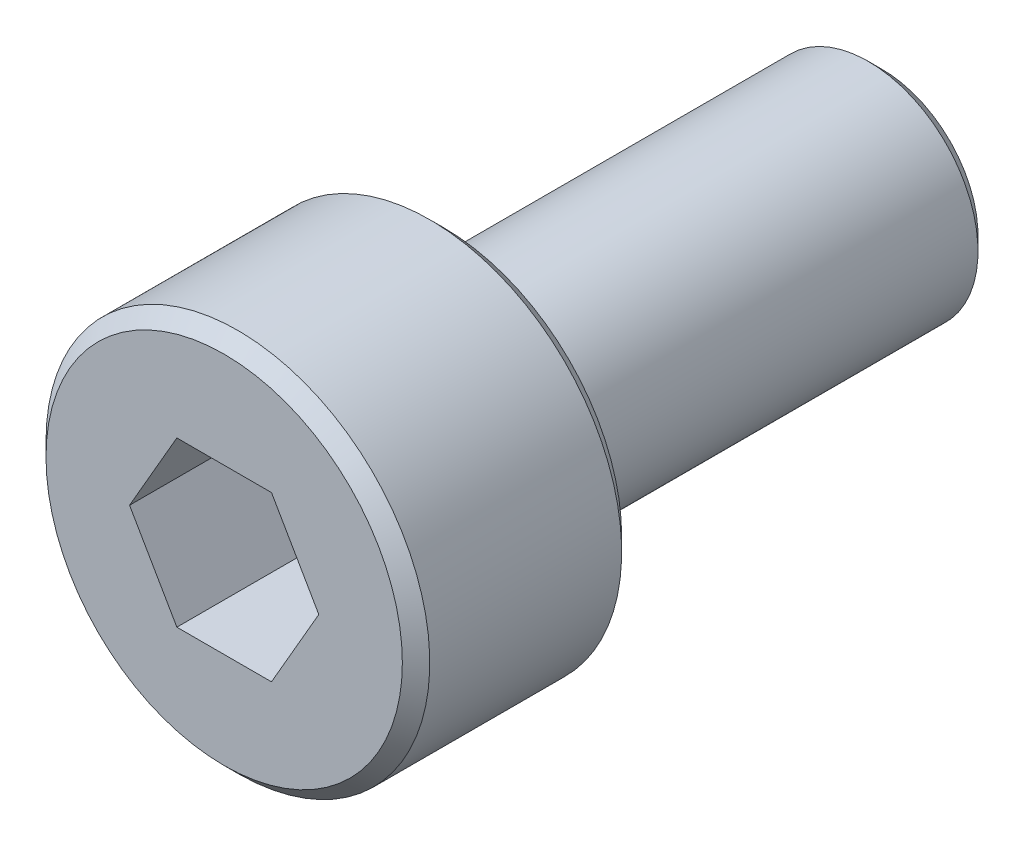
ISO-10303-21;
HEADER;
FILE_DESCRIPTION(('STEP AP214'),'2;1');
FILE_NAME('part.step','',(''),(''),'','','');
FILE_SCHEMA(('AUTOMOTIVE_DESIGN { 1 0 10303 214 1 1 1 1 }'));
ENDSEC;
DATA;
#1=APPLICATION_CONTEXT('core data for automotive mechanical design processes');
#2=APPLICATION_PROTOCOL_DEFINITION('international standard','automotive_design',2000,#1);
#3=PRODUCT_CONTEXT('',#1,'mechanical');
#4=PRODUCT('Part','Part','',(#3));
#5=PRODUCT_RELATED_PRODUCT_CATEGORY('part','',(#4));
#6=PRODUCT_DEFINITION_FORMATION('','',#4);
#7=PRODUCT_DEFINITION_CONTEXT('part definition',#1,'design');
#8=PRODUCT_DEFINITION('design','',#6,#7);
#9=PRODUCT_DEFINITION_SHAPE('','',#8);
#10=(LENGTH_UNIT() NAMED_UNIT(*) SI_UNIT(.MILLI.,.METRE.));
#11=(NAMED_UNIT(*) PLANE_ANGLE_UNIT() SI_UNIT($,.RADIAN.));
#12=(NAMED_UNIT(*) SI_UNIT($,.STERADIAN.) SOLID_ANGLE_UNIT());
#13=UNCERTAINTY_MEASURE_WITH_UNIT(LENGTH_MEASURE(1.E-05),#10,'distance_accuracy_value','');
#14=(GEOMETRIC_REPRESENTATION_CONTEXT(3) GLOBAL_UNCERTAINTY_ASSIGNED_CONTEXT((#13)) GLOBAL_UNIT_ASSIGNED_CONTEXT((#10,
#11,#12)) REPRESENTATION_CONTEXT('',''));
#15=CARTESIAN_POINT('',(0.,0.,0.));
#16=DIRECTION('',(0.,0.,1.));
#17=DIRECTION('',(1.,0.,0.));
#18=AXIS2_PLACEMENT_3D('',#15,#16,#17);
#19=CARTESIAN_POINT('',(0.,0.,0.));
#20=DIRECTION('',(0.,0.,-1.));
#21=DIRECTION('',(-1.,0.,0.));
#22=AXIS2_PLACEMENT_3D('',#19,#20,#21);
#23=PLANE('',#22);
#24=CARTESIAN_POINT('',(0.,0.,0.));
#25=DIRECTION('',(0.,0.,-1.));
#26=DIRECTION('',(-1.,0.,0.));
#27=AXIS2_PLACEMENT_3D('',#24,#25,#26);
#28=CIRCLE('',#27,3.25000000000591);
#29=CARTESIAN_POINT('',(-3.25000000000591,0.,0.));
#30=VERTEX_POINT('',#29);
#31=EDGE_CURVE('E11',#30,#30,#28,.T.);
#32=ORIENTED_EDGE('',*,*,#31,.T.);
#33=EDGE_LOOP('',(#32));
#34=FACE_BOUND('',#33,.T.);
#35=CARTESIAN_POINT('',(0.,0.,0.));
#36=DIRECTION('',(0.,0.,-1.));
#37=DIRECTION('',(-1.,0.,0.));
#38=AXIS2_PLACEMENT_3D('',#35,#36,#37);
#39=CIRCLE('',#38,2.);
#40=CARTESIAN_POINT('',(-2.,0.,0.));
#41=VERTEX_POINT('',#40);
#42=EDGE_CURVE('E134',#41,#41,#39,.T.);
#43=ORIENTED_EDGE('',*,*,#42,.F.);
#44=EDGE_LOOP('',(#43));
#45=FACE_BOUND('',#44,.T.);
#46=ADVANCED_FACE('F32',(#34,#45),#23,.T.);
#47=CARTESIAN_POINT('',(0.,0.,0.));
#48=DIRECTION('',(0.,0.,1.));
#49=DIRECTION('',(1.,0.,0.));
#50=AXIS2_PLACEMENT_3D('',#47,#48,#49);
#51=CYLINDRICAL_SURFACE('',#50,3.5);
#52=CARTESIAN_POINT('',(0.,0.,3.75000000000591));
#53=DIRECTION('',(0.,0.,-1.));
#54=DIRECTION('',(-1.,0.,0.));
#55=AXIS2_PLACEMENT_3D('',#52,#53,#54);
#56=CIRCLE('',#55,3.5);
#57=CARTESIAN_POINT('',(-3.5,0.,3.75000000000591));
#58=VERTEX_POINT('',#57);
#59=EDGE_CURVE('E148',#58,#58,#56,.T.);
#60=ORIENTED_EDGE('',*,*,#59,.T.);
#61=EDGE_LOOP('',(#60));
#62=FACE_BOUND('',#61,.T.);
#63=CARTESIAN_POINT('',(0.,0.,0.249999999994088));
#64=DIRECTION('',(0.,0.,-1.));
#65=DIRECTION('',(-1.,0.,0.));
#66=AXIS2_PLACEMENT_3D('',#63,#64,#65);
#67=CIRCLE('',#66,3.5);
#68=CARTESIAN_POINT('',(-3.5,0.,0.249999999994088));
#69=VERTEX_POINT('',#68);
#70=EDGE_CURVE('E145',#69,#69,#67,.F.);
#71=ORIENTED_EDGE('',*,*,#70,.T.);
#72=EDGE_LOOP('',(#71));
#73=FACE_BOUND('',#72,.T.);
#74=ADVANCED_FACE('F178',(#62,#73),#51,.T.);
#75=CARTESIAN_POINT('',(0.,0.,4.));
#76=DIRECTION('',(0.,0.,-1.));
#77=DIRECTION('',(-1.,0.,0.));
#78=AXIS2_PLACEMENT_3D('',#75,#76,#77);
#79=PLANE('',#78);
#80=CARTESIAN_POINT('',(0.,0.,4.));
#81=DIRECTION('',(0.,0.,-1.));
#82=DIRECTION('',(-1.,0.,0.));
#83=AXIS2_PLACEMENT_3D('',#80,#81,#82);
#84=CIRCLE('',#83,3.25000000000591);
#85=CARTESIAN_POINT('',(-3.25000000000591,0.,4.));
#86=VERTEX_POINT('',#85);
#87=EDGE_CURVE('E142',#86,#86,#84,.F.);
#88=ORIENTED_EDGE('',*,*,#87,.T.);
#89=EDGE_LOOP('',(#88));
#90=FACE_BOUND('',#89,.T.);
#91=DIRECTION('',(0.499999999999998,-0.86602540378444,0.));
#92=VECTOR('',#91,1.);
#93=CARTESIAN_POINT('',(-1.72601092122562,0.,4.));
#94=LINE('',#93,#92);
#95=CARTESIAN_POINT('',(-1.72601092122562,0.,4.));
#96=VERTEX_POINT('',#95);
#97=CARTESIAN_POINT('',(-0.863005460612813,-1.49476930499077,4.));
#98=VERTEX_POINT('',#97);
#99=EDGE_CURVE('E121',#96,#98,#94,.T.);
#100=ORIENTED_EDGE('',*,*,#99,.F.);
#101=DIRECTION('',(-0.500000000000001,-0.866025403784438,0.));
#102=VECTOR('',#101,1.);
#103=CARTESIAN_POINT('',(-0.863005460612807,1.49476930499077,4.));
#104=LINE('',#103,#102);
#105=CARTESIAN_POINT('',(-0.863005460612807,1.49476930499077,4.));
#106=VERTEX_POINT('',#105);
#107=EDGE_CURVE('E47',#106,#96,#104,.T.);
#108=ORIENTED_EDGE('',*,*,#107,.F.);
#109=DIRECTION('',(-1.,0.,0.));
#110=VECTOR('',#109,1.);
#111=CARTESIAN_POINT('',(0.863005460612808,1.49476930499077,4.));
#112=LINE('',#111,#110);
#113=CARTESIAN_POINT('',(0.863005460612808,1.49476930499077,4.));
#114=VERTEX_POINT('',#113);
#115=EDGE_CURVE('E130',#114,#106,#112,.T.);
#116=ORIENTED_EDGE('',*,*,#115,.F.);
#117=DIRECTION('',(-0.499999999999999,0.866025403784439,0.));
#118=VECTOR('',#117,1.);
#119=CARTESIAN_POINT('',(1.72601092122562,0.,4.));
#120=LINE('',#119,#118);
#121=CARTESIAN_POINT('',(1.72601092122562,0.,4.));
#122=VERTEX_POINT('',#121);
#123=EDGE_CURVE('E128',#122,#114,#120,.T.);
#124=ORIENTED_EDGE('',*,*,#123,.F.);
#125=DIRECTION('',(0.499999999999999,0.866025403784439,0.));
#126=VECTOR('',#125,1.);
#127=CARTESIAN_POINT('',(0.863005460612809,-1.49476930499077,4.));
#128=LINE('',#127,#126);
#129=CARTESIAN_POINT('',(0.863005460612809,-1.49476930499077,4.));
#130=VERTEX_POINT('',#129);
#131=EDGE_CURVE('E95',#130,#122,#128,.T.);
#132=ORIENTED_EDGE('',*,*,#131,.F.);
#133=DIRECTION('',(1.,0.,0.));
#134=VECTOR('',#133,1.);
#135=CARTESIAN_POINT('',(-0.863005460612813,-1.49476930499077,4.));
#136=LINE('',#135,#134);
#137=EDGE_CURVE('E124',#98,#130,#136,.T.);
#138=ORIENTED_EDGE('',*,*,#137,.F.);
#139=EDGE_LOOP('',(#100,#108,#116,#124,#132,#138));
#140=FACE_BOUND('',#139,.T.);
#141=ADVANCED_FACE('F175',(#90,#140),#79,.F.);
#142=CARTESIAN_POINT('',(0.,0.,-8.));
#143=DIRECTION('',(0.,0.,1.));
#144=DIRECTION('',(1.,0.,0.));
#145=AXIS2_PLACEMENT_3D('',#142,#143,#144);
#146=CYLINDRICAL_SURFACE('',#145,2.);
#147=CARTESIAN_POINT('',(0.,0.,-7.75000000000591));
#148=DIRECTION('',(0.,0.,-1.));
#149=DIRECTION('',(-1.,0.,0.));
#150=AXIS2_PLACEMENT_3D('',#147,#148,#149);
#151=CIRCLE('',#150,2.);
#152=CARTESIAN_POINT('',(-2.,0.,-7.75000000000591));
#153=VERTEX_POINT('',#152);
#154=EDGE_CURVE('E40',#153,#153,#151,.F.);
#155=ORIENTED_EDGE('',*,*,#154,.T.);
#156=EDGE_LOOP('',(#155));
#157=FACE_BOUND('',#156,.T.);
#158=ORIENTED_EDGE('',*,*,#42,.T.);
#159=EDGE_LOOP('',(#158));
#160=FACE_BOUND('',#159,.T.);
#161=ADVANCED_FACE('F156',(#157,#160),#146,.T.);
#162=CARTESIAN_POINT('',(0.,0.,-8.));
#163=DIRECTION('',(0.,0.,-1.));
#164=DIRECTION('',(-1.,0.,0.));
#165=AXIS2_PLACEMENT_3D('',#162,#163,#164);
#166=PLANE('',#165);
#167=CARTESIAN_POINT('',(0.,0.,-8.));
#168=DIRECTION('',(0.,0.,-1.));
#169=DIRECTION('',(-1.,0.,0.));
#170=AXIS2_PLACEMENT_3D('',#167,#168,#169);
#171=CIRCLE('',#170,1.75000000000591);
#172=CARTESIAN_POINT('',(-1.75000000000591,0.,-8.));
#173=VERTEX_POINT('',#172);
#174=EDGE_CURVE('E151',#173,#173,#171,.T.);
#175=ORIENTED_EDGE('',*,*,#174,.T.);
#176=EDGE_LOOP('',(#175));
#177=FACE_BOUND('',#176,.T.);
#178=ADVANCED_FACE('F165',(#177),#166,.T.);
#179=CARTESIAN_POINT('',(-0.863005460612807,1.49476930499077,1.));
#180=DIRECTION('',(-0.866025403784438,0.500000000000001,0.));
#181=DIRECTION('',(-0.500000000000001,-0.866025403784438,0.));
#182=AXIS2_PLACEMENT_3D('',#179,#180,#181);
#183=PLANE('',#182);
#184=ORIENTED_EDGE('',*,*,#107,.T.);
#185=DIRECTION('',(0.,0.,1.));
#186=VECTOR('',#185,1.);
#187=CARTESIAN_POINT('',(-1.72601092122562,0.,1.));
#188=LINE('',#187,#186);
#189=CARTESIAN_POINT('',(-1.72601092122562,0.,1.));
#190=VERTEX_POINT('',#189);
#191=EDGE_CURVE('E77',#190,#96,#188,.T.);
#192=ORIENTED_EDGE('',*,*,#191,.F.);
#193=DIRECTION('',(-0.500000000000001,-0.866025403784438,0.));
#194=VECTOR('',#193,1.);
#195=CARTESIAN_POINT('',(-0.863005460612807,1.49476930499077,1.));
#196=LINE('',#195,#194);
#197=CARTESIAN_POINT('',(-0.863005460612807,1.49476930499077,1.));
#198=VERTEX_POINT('',#197);
#199=EDGE_CURVE('E132',#198,#190,#196,.T.);
#200=ORIENTED_EDGE('',*,*,#199,.F.);
#201=DIRECTION('',(0.,0.,1.));
#202=VECTOR('',#201,1.);
#203=CARTESIAN_POINT('',(-0.863005460612807,1.49476930499077,1.));
#204=LINE('',#203,#202);
#205=EDGE_CURVE('E55',#198,#106,#204,.T.);
#206=ORIENTED_EDGE('',*,*,#205,.T.);
#207=EDGE_LOOP('',(#184,#192,#200,#206));
#208=FACE_BOUND('',#207,.T.);
#209=ADVANCED_FACE('F167',(#208),#183,.F.);
#210=CARTESIAN_POINT('',(0.863005460612808,1.49476930499077,1.));
#211=DIRECTION('',(0.,1.,0.));
#212=DIRECTION('',(-1.,0.,0.));
#213=AXIS2_PLACEMENT_3D('',#210,#211,#212);
#214=PLANE('',#213);
#215=ORIENTED_EDGE('',*,*,#115,.T.);
#216=ORIENTED_EDGE('',*,*,#205,.F.);
#217=DIRECTION('',(-1.,0.,0.));
#218=VECTOR('',#217,1.);
#219=CARTESIAN_POINT('',(0.863005460612808,1.49476930499077,1.));
#220=LINE('',#219,#218);
#221=CARTESIAN_POINT('',(0.863005460612808,1.49476930499077,1.));
#222=VERTEX_POINT('',#221);
#223=EDGE_CURVE('E107',#222,#198,#220,.T.);
#224=ORIENTED_EDGE('',*,*,#223,.F.);
#225=DIRECTION('',(0.,0.,1.));
#226=VECTOR('',#225,1.);
#227=CARTESIAN_POINT('',(0.863005460612808,1.49476930499077,1.));
#228=LINE('',#227,#226);
#229=EDGE_CURVE('E99',#222,#114,#228,.T.);
#230=ORIENTED_EDGE('',*,*,#229,.T.);
#231=EDGE_LOOP('',(#215,#216,#224,#230));
#232=FACE_BOUND('',#231,.T.);
#233=ADVANCED_FACE('F173',(#232),#214,.F.);
#234=CARTESIAN_POINT('',(1.72601092122562,0.,1.));
#235=DIRECTION('',(0.866025403784439,0.5,0.));
#236=DIRECTION('',(-0.5,0.866025403784439,0.));
#237=AXIS2_PLACEMENT_3D('',#234,#235,#236);
#238=PLANE('',#237);
#239=ORIENTED_EDGE('',*,*,#123,.T.);
#240=ORIENTED_EDGE('',*,*,#229,.F.);
#241=DIRECTION('',(-0.499999999999999,0.866025403784439,0.));
#242=VECTOR('',#241,1.);
#243=CARTESIAN_POINT('',(1.72601092122562,0.,1.));
#244=LINE('',#243,#242);
#245=CARTESIAN_POINT('',(1.72601092122562,0.,1.));
#246=VERTEX_POINT('',#245);
#247=EDGE_CURVE('E103',#246,#222,#244,.T.);
#248=ORIENTED_EDGE('',*,*,#247,.F.);
#249=DIRECTION('',(0.,0.,1.));
#250=VECTOR('',#249,1.);
#251=CARTESIAN_POINT('',(1.72601092122562,0.,1.));
#252=LINE('',#251,#250);
#253=EDGE_CURVE('E88',#246,#122,#252,.T.);
#254=ORIENTED_EDGE('',*,*,#253,.T.);
#255=EDGE_LOOP('',(#239,#240,#248,#254));
#256=FACE_BOUND('',#255,.T.);
#257=ADVANCED_FACE('F104',(#256),#238,.F.);
#258=CARTESIAN_POINT('',(0.863005460612809,-1.49476930499077,1.));
#259=DIRECTION('',(0.866025403784439,-0.499999999999999,0.));
#260=DIRECTION('',(0.499999999999999,0.866025403784439,0.));
#261=AXIS2_PLACEMENT_3D('',#258,#259,#260);
#262=PLANE('',#261);
#263=ORIENTED_EDGE('',*,*,#131,.T.);
#264=ORIENTED_EDGE('',*,*,#253,.F.);
#265=DIRECTION('',(0.499999999999999,0.866025403784439,0.));
#266=VECTOR('',#265,1.);
#267=CARTESIAN_POINT('',(0.863005460612809,-1.49476930499077,1.));
#268=LINE('',#267,#266);
#269=CARTESIAN_POINT('',(0.863005460612809,-1.49476930499077,1.));
#270=VERTEX_POINT('',#269);
#271=EDGE_CURVE('E92',#270,#246,#268,.T.);
#272=ORIENTED_EDGE('',*,*,#271,.F.);
#273=DIRECTION('',(0.,0.,1.));
#274=VECTOR('',#273,1.);
#275=CARTESIAN_POINT('',(0.863005460612809,-1.49476930499077,1.));
#276=LINE('',#275,#274);
#277=EDGE_CURVE('E100',#270,#130,#276,.T.);
#278=ORIENTED_EDGE('',*,*,#277,.T.);
#279=EDGE_LOOP('',(#263,#264,#272,#278));
#280=FACE_BOUND('',#279,.T.);
#281=ADVANCED_FACE('F90',(#280),#262,.F.);
#282=CARTESIAN_POINT('',(-0.863005460612813,-1.49476930499077,1.));
#283=DIRECTION('',(0.,-1.,0.));
#284=DIRECTION('',(1.,0.,0.));
#285=AXIS2_PLACEMENT_3D('',#282,#283,#284);
#286=PLANE('',#285);
#287=ORIENTED_EDGE('',*,*,#137,.T.);
#288=ORIENTED_EDGE('',*,*,#277,.F.);
#289=DIRECTION('',(1.,0.,0.));
#290=VECTOR('',#289,1.);
#291=CARTESIAN_POINT('',(-0.863005460612813,-1.49476930499077,1.));
#292=LINE('',#291,#290);
#293=CARTESIAN_POINT('',(-0.863005460612813,-1.49476930499077,1.));
#294=VERTEX_POINT('',#293);
#295=EDGE_CURVE('E113',#294,#270,#292,.T.);
#296=ORIENTED_EDGE('',*,*,#295,.F.);
#297=DIRECTION('',(0.,0.,1.));
#298=VECTOR('',#297,1.);
#299=CARTESIAN_POINT('',(-0.863005460612813,-1.49476930499077,1.));
#300=LINE('',#299,#298);
#301=EDGE_CURVE('E137',#294,#98,#300,.T.);
#302=ORIENTED_EDGE('',*,*,#301,.T.);
#303=EDGE_LOOP('',(#287,#288,#296,#302));
#304=FACE_BOUND('',#303,.T.);
#305=ADVANCED_FACE('F216',(#304),#286,.F.);
#306=CARTESIAN_POINT('',(-1.72601092122562,0.,1.));
#307=DIRECTION('',(-0.86602540378444,-0.499999999999998,0.));
#308=DIRECTION('',(0.499999999999998,-0.86602540378444,0.));
#309=AXIS2_PLACEMENT_3D('',#306,#307,#308);
#310=PLANE('',#309);
#311=ORIENTED_EDGE('',*,*,#99,.T.);
#312=ORIENTED_EDGE('',*,*,#301,.F.);
#313=DIRECTION('',(0.499999999999998,-0.86602540378444,0.));
#314=VECTOR('',#313,1.);
#315=CARTESIAN_POINT('',(-1.72601092122562,0.,1.));
#316=LINE('',#315,#314);
#317=EDGE_CURVE('E115',#190,#294,#316,.T.);
#318=ORIENTED_EDGE('',*,*,#317,.F.);
#319=ORIENTED_EDGE('',*,*,#191,.T.);
#320=EDGE_LOOP('',(#311,#312,#318,#319));
#321=FACE_BOUND('',#320,.T.);
#322=ADVANCED_FACE('F196',(#321),#310,.F.);
#323=CARTESIAN_POINT('',(0.,0.,1.));
#324=DIRECTION('',(0.,0.,1.));
#325=DIRECTION('',(1.,0.,0.));
#326=AXIS2_PLACEMENT_3D('',#323,#324,#325);
#327=PLANE('',#326);
#328=ORIENTED_EDGE('',*,*,#199,.T.);
#329=ORIENTED_EDGE('',*,*,#317,.T.);
#330=ORIENTED_EDGE('',*,*,#295,.T.);
#331=ORIENTED_EDGE('',*,*,#271,.T.);
#332=ORIENTED_EDGE('',*,*,#247,.T.);
#333=ORIENTED_EDGE('',*,*,#223,.T.);
#334=EDGE_LOOP('',(#328,#329,#330,#331,#332,#333));
#335=FACE_BOUND('',#334,.T.);
#336=ADVANCED_FACE('F110',(#335),#327,.T.);
#337=CARTESIAN_POINT('',(0.,0.,4.));
#338=DIRECTION('',(0.,0.,-1.));
#339=DIRECTION('',(-1.,0.,0.));
#340=AXIS2_PLACEMENT_3D('',#337,#338,#339);
#341=CONICAL_SURFACE('',#340,3.25000000000591,0.785398163397448);
#342=ORIENTED_EDGE('',*,*,#59,.F.);
#343=EDGE_LOOP('',(#342));
#344=FACE_BOUND('',#343,.T.);
#345=ORIENTED_EDGE('',*,*,#87,.F.);
#346=EDGE_LOOP('',(#345));
#347=FACE_BOUND('',#346,.T.);
#348=ADVANCED_FACE('F162',(#344,#347),#341,.T.);
#349=CARTESIAN_POINT('',(0.,0.,-8.));
#350=DIRECTION('',(0.,0.,1.));
#351=DIRECTION('',(1.,0.,0.));
#352=AXIS2_PLACEMENT_3D('',#349,#350,#351);
#353=CONICAL_SURFACE('',#352,1.75000000000591,0.785398163397448);
#354=ORIENTED_EDGE('',*,*,#154,.F.);
#355=EDGE_LOOP('',(#354));
#356=FACE_BOUND('',#355,.T.);
#357=ORIENTED_EDGE('',*,*,#174,.F.);
#358=EDGE_LOOP('',(#357));
#359=FACE_BOUND('',#358,.T.);
#360=ADVANCED_FACE('F159',(#356,#359),#353,.T.);
#361=CARTESIAN_POINT('',(0.,0.,0.249999999994088));
#362=DIRECTION('',(0.,0.,1.));
#363=DIRECTION('',(1.,0.,0.));
#364=AXIS2_PLACEMENT_3D('',#361,#362,#363);
#365=CONICAL_SURFACE('',#364,3.5,0.785398163397452);
#366=ORIENTED_EDGE('',*,*,#31,.F.);
#367=EDGE_LOOP('',(#366));
#368=FACE_BOUND('',#367,.T.);
#369=ORIENTED_EDGE('',*,*,#70,.F.);
#370=EDGE_LOOP('',(#369));
#371=FACE_BOUND('',#370,.T.);
#372=ADVANCED_FACE('F34',(#368,#371),#365,.T.);
#373=CLOSED_SHELL('',(#46,#74,#141,#161,#178,#209,#233,#257,#281,#305,#322,#336,#348,#360,#372));
#374=MANIFOLD_SOLID_BREP('B2',#373);
#375=ADVANCED_BREP_SHAPE_REPRESENTATION('',(#18,#374),#14);
#376=SHAPE_DEFINITION_REPRESENTATION(#9,#375);
ENDSEC;
END-ISO-10303-21;
